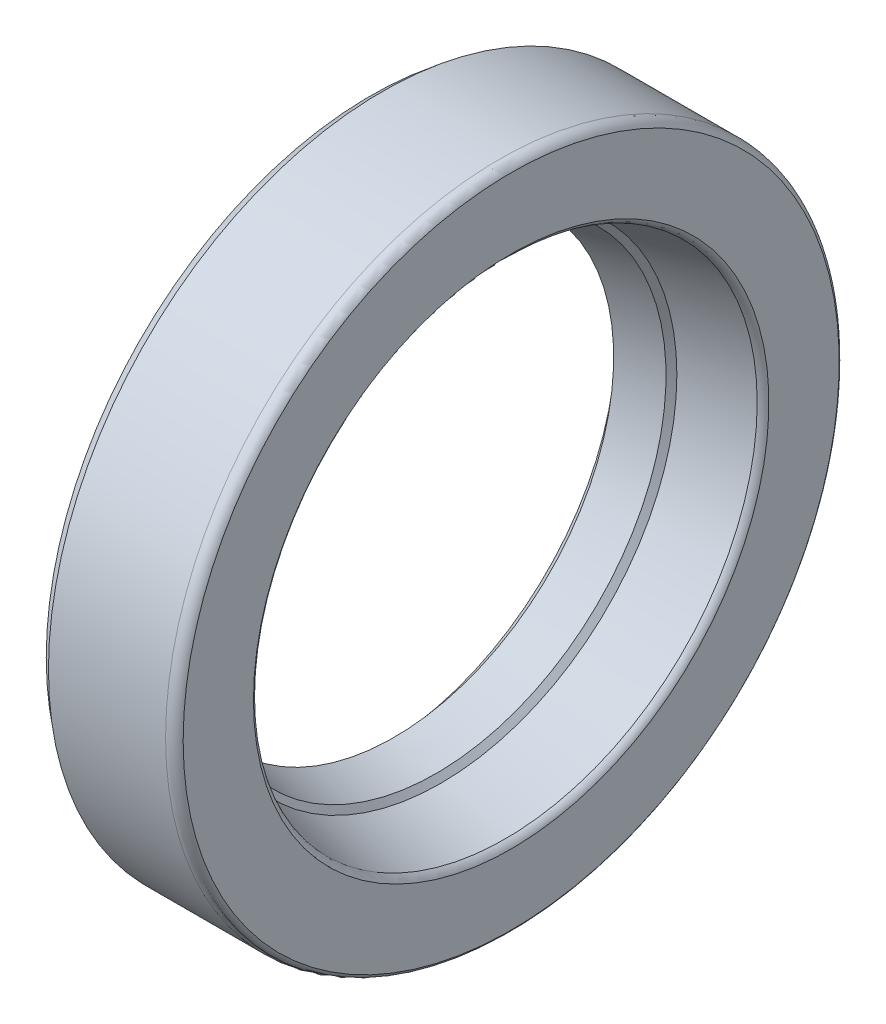
ISO-10303-21;
HEADER;
FILE_DESCRIPTION(('STEP AP214'),'2;1');
FILE_NAME('part.step','',(''),(''),'','','');
FILE_SCHEMA(('AUTOMOTIVE_DESIGN { 1 0 10303 214 1 1 1 1 }'));
ENDSEC;
DATA;
#1=APPLICATION_CONTEXT('core data for automotive mechanical design processes');
#2=APPLICATION_PROTOCOL_DEFINITION('international standard','automotive_design',2000,#1);
#3=PRODUCT_CONTEXT('',#1,'mechanical');
#4=PRODUCT('Part','Part','',(#3));
#5=PRODUCT_RELATED_PRODUCT_CATEGORY('part','',(#4));
#6=PRODUCT_DEFINITION_FORMATION('','',#4);
#7=PRODUCT_DEFINITION_CONTEXT('part definition',#1,'design');
#8=PRODUCT_DEFINITION('design','',#6,#7);
#9=PRODUCT_DEFINITION_SHAPE('','',#8);
#10=(LENGTH_UNIT() NAMED_UNIT(*) SI_UNIT(.MILLI.,.METRE.));
#11=(NAMED_UNIT(*) PLANE_ANGLE_UNIT() SI_UNIT($,.RADIAN.));
#12=(NAMED_UNIT(*) SI_UNIT($,.STERADIAN.) SOLID_ANGLE_UNIT());
#13=UNCERTAINTY_MEASURE_WITH_UNIT(LENGTH_MEASURE(1.E-05),#10,'distance_accuracy_value','');
#14=(GEOMETRIC_REPRESENTATION_CONTEXT(3) GLOBAL_UNCERTAINTY_ASSIGNED_CONTEXT((#13)) GLOBAL_UNIT_ASSIGNED_CONTEXT((#10,
#11,#12)) REPRESENTATION_CONTEXT('',''));
#15=CARTESIAN_POINT('',(0.,0.,0.));
#16=DIRECTION('',(0.,0.,1.));
#17=DIRECTION('',(1.,0.,0.));
#18=AXIS2_PLACEMENT_3D('',#15,#16,#17);
#19=CARTESIAN_POINT('',(0.,0.,0.));
#20=DIRECTION('',(-1.,0.,0.));
#21=DIRECTION('',(0.,0.,1.));
#22=AXIS2_PLACEMENT_3D('',#19,#20,#21);
#23=CYLINDRICAL_SURFACE('',#22,19.);
#24=CARTESIAN_POINT('',(7.33333333333333,0.,0.));
#25=DIRECTION('',(-1.,0.,0.));
#26=DIRECTION('',(0.,0.,1.));
#27=AXIS2_PLACEMENT_3D('',#24,#25,#26);
#28=CIRCLE('',#27,19.);
#29=CARTESIAN_POINT('',(7.33333333333333,0.,19.));
#30=VERTEX_POINT('',#29);
#31=EDGE_CURVE('E10',#30,#30,#28,.T.);
#32=ORIENTED_EDGE('',*,*,#31,.T.);
#33=EDGE_LOOP('',(#32));
#34=FACE_BOUND('',#33,.T.);
#35=CARTESIAN_POINT('',(0.666666666666667,0.,0.));
#36=DIRECTION('',(-1.,0.,0.));
#37=DIRECTION('',(0.,0.,1.));
#38=AXIS2_PLACEMENT_3D('',#35,#36,#37);
#39=CIRCLE('',#38,19.);
#40=CARTESIAN_POINT('',(0.666666666666667,0.,19.));
#41=VERTEX_POINT('',#40);
#42=EDGE_CURVE('E70',#41,#41,#39,.T.);
#43=ORIENTED_EDGE('',*,*,#42,.F.);
#44=EDGE_LOOP('',(#43));
#45=FACE_BOUND('',#44,.T.);
#46=ADVANCED_FACE('F15',(#34,#45),#23,.T.);
#47=CARTESIAN_POINT('',(7.41946005043015,0.,0.));
#48=DIRECTION('',(-1.,0.,0.));
#49=DIRECTION('',(0.,0.,1.));
#50=AXIS2_PLACEMENT_3D('',#47,#48,#49);
#51=TOROIDAL_SURFACE('',#50,18.3389201008603,0.666666666666667);
#52=ORIENTED_EDGE('',*,*,#31,.F.);
#53=EDGE_LOOP('',(#52));
#54=FACE_BOUND('',#53,.T.);
#55=CARTESIAN_POINT('',(8.,0.,0.));
#56=DIRECTION('',(-1.,0.,0.));
#57=DIRECTION('',(0.,0.,1.));
#58=AXIS2_PLACEMENT_3D('',#55,#56,#57);
#59=CIRCLE('',#58,18.6666666666667);
#60=CARTESIAN_POINT('',(8.,0.,18.6666666666667));
#61=VERTEX_POINT('',#60);
#62=EDGE_CURVE('E21',#61,#61,#59,.T.);
#63=ORIENTED_EDGE('',*,*,#62,.T.);
#64=EDGE_LOOP('',(#63));
#65=FACE_BOUND('',#64,.T.);
#66=ADVANCED_FACE('F78',(#54,#65),#51,.T.);
#67=CARTESIAN_POINT('',(8.,18.6666666666667,0.));
#68=DIRECTION('',(1.,0.,0.));
#69=DIRECTION('',(0.,0.,-1.));
#70=AXIS2_PLACEMENT_3D('',#67,#68,#69);
#71=PLANE('',#70);
#72=CARTESIAN_POINT('',(8.,0.,0.));
#73=DIRECTION('',(-1.,0.,0.));
#74=DIRECTION('',(0.,0.,1.));
#75=AXIS2_PLACEMENT_3D('',#72,#73,#74);
#76=CIRCLE('',#75,14.6666666666667);
#77=CARTESIAN_POINT('',(8.,0.,14.6666666666667));
#78=VERTEX_POINT('',#77);
#79=EDGE_CURVE('E25',#78,#78,#76,.T.);
#80=ORIENTED_EDGE('',*,*,#79,.T.);
#81=EDGE_LOOP('',(#80));
#82=FACE_BOUND('',#81,.T.);
#83=ORIENTED_EDGE('',*,*,#62,.F.);
#84=EDGE_LOOP('',(#83));
#85=FACE_BOUND('',#84,.T.);
#86=ADVANCED_FACE('F83',(#82,#85),#71,.T.);
#87=CARTESIAN_POINT('',(7.39237478148924,0.,0.));
#88=DIRECTION('',(-1.,0.,0.));
#89=DIRECTION('',(0.,0.,1.));
#90=AXIS2_PLACEMENT_3D('',#87,#88,#89);
#91=TOROIDAL_SURFACE('',#90,14.9409585518441,0.666666666666667);
#92=ORIENTED_EDGE('',*,*,#79,.F.);
#93=EDGE_LOOP('',(#92));
#94=FACE_BOUND('',#93,.T.);
#95=CARTESIAN_POINT('',(7.66666666666667,0.,0.));
#96=DIRECTION('',(-1.,0.,0.));
#97=DIRECTION('',(0.,0.,1.));
#98=AXIS2_PLACEMENT_3D('',#95,#96,#97);
#99=CIRCLE('',#98,14.3333333333333);
#100=CARTESIAN_POINT('',(7.66666666666667,0.,14.3333333333333));
#101=VERTEX_POINT('',#100);
#102=EDGE_CURVE('E29',#101,#101,#99,.T.);
#103=ORIENTED_EDGE('',*,*,#102,.T.);
#104=EDGE_LOOP('',(#103));
#105=FACE_BOUND('',#104,.T.);
#106=ADVANCED_FACE('F88',(#94,#105),#91,.T.);
#107=CARTESIAN_POINT('',(7.66666666666667,0.,0.));
#108=DIRECTION('',(1.,0.,0.));
#109=DIRECTION('',(0.,0.,-1.));
#110=AXIS2_PLACEMENT_3D('',#107,#108,#109);
#111=CONICAL_SURFACE('',#110,14.3333333333333,0.241920568684405);
#112=CARTESIAN_POINT('',(4.,0.,0.));
#113=DIRECTION('',(-1.,0.,0.));
#114=DIRECTION('',(0.,0.,1.));
#115=AXIS2_PLACEMENT_3D('',#112,#113,#114);
#116=CIRCLE('',#115,13.4285714285714);
#117=CARTESIAN_POINT('',(4.,0.,13.4285714285714));
#118=VERTEX_POINT('',#117);
#119=EDGE_CURVE('E34',#118,#118,#116,.T.);
#120=ORIENTED_EDGE('',*,*,#119,.T.);
#121=EDGE_LOOP('',(#120));
#122=FACE_BOUND('',#121,.T.);
#123=ORIENTED_EDGE('',*,*,#102,.F.);
#124=EDGE_LOOP('',(#123));
#125=FACE_BOUND('',#124,.T.);
#126=ADVANCED_FACE('F94',(#122,#125),#111,.F.);
#127=CARTESIAN_POINT('',(4.,0.,0.));
#128=DIRECTION('',(1.,0.,0.));
#129=DIRECTION('',(0.,0.,-1.));
#130=AXIS2_PLACEMENT_3D('',#127,#128,#129);
#131=CONICAL_SURFACE('',#130,13.4285714285714,0.920811159017041);
#132=CARTESIAN_POINT('',(3.73333333333334,0.,0.));
#133=DIRECTION('',(-1.,0.,0.));
#134=DIRECTION('',(0.,0.,1.));
#135=AXIS2_PLACEMENT_3D('',#132,#133,#134);
#136=CIRCLE('',#135,13.0777777777778);
#137=CARTESIAN_POINT('',(3.73333333333334,0.,13.0777777777778));
#138=VERTEX_POINT('',#137);
#139=EDGE_CURVE('E37',#138,#138,#136,.T.);
#140=ORIENTED_EDGE('',*,*,#139,.T.);
#141=EDGE_LOOP('',(#140));
#142=FACE_BOUND('',#141,.T.);
#143=ORIENTED_EDGE('',*,*,#119,.F.);
#144=EDGE_LOOP('',(#143));
#145=FACE_BOUND('',#144,.T.);
#146=ADVANCED_FACE('F98',(#142,#145),#131,.F.);
#147=CARTESIAN_POINT('',(3.73333333333334,0.,0.));
#148=DIRECTION('',(1.,0.,0.));
#149=DIRECTION('',(0.,0.,-1.));
#150=AXIS2_PLACEMENT_3D('',#147,#148,#149);
#151=CONICAL_SURFACE('',#150,13.0777777777778,0.236245260718437);
#152=CARTESIAN_POINT('',(1.33333333333333,0.,0.));
#153=DIRECTION('',(-1.,0.,0.));
#154=DIRECTION('',(0.,0.,1.));
#155=AXIS2_PLACEMENT_3D('',#152,#153,#154);
#156=CIRCLE('',#155,12.5);
#157=CARTESIAN_POINT('',(1.33333333333333,0.,12.5));
#158=VERTEX_POINT('',#157);
#159=EDGE_CURVE('E40',#158,#158,#156,.T.);
#160=ORIENTED_EDGE('',*,*,#159,.T.);
#161=EDGE_LOOP('',(#160));
#162=FACE_BOUND('',#161,.T.);
#163=ORIENTED_EDGE('',*,*,#139,.F.);
#164=EDGE_LOOP('',(#163));
#165=FACE_BOUND('',#164,.T.);
#166=ADVANCED_FACE('F102',(#162,#165),#151,.F.);
#167=CARTESIAN_POINT('',(1.33333333333333,0.,0.));
#168=DIRECTION('',(-1.,0.,0.));
#169=DIRECTION('',(0.,0.,1.));
#170=AXIS2_PLACEMENT_3D('',#167,#168,#169);
#171=CONICAL_SURFACE('',#170,12.5,0.85964161504903);
#172=CARTESIAN_POINT('',(0.533333333333333,0.,0.));
#173=DIRECTION('',(-1.,0.,0.));
#174=DIRECTION('',(0.,0.,1.));
#175=AXIS2_PLACEMENT_3D('',#172,#173,#174);
#176=CIRCLE('',#175,13.4285714285714);
#177=CARTESIAN_POINT('',(0.533333333333333,0.,13.4285714285714));
#178=VERTEX_POINT('',#177);
#179=EDGE_CURVE('E43',#178,#178,#176,.T.);
#180=ORIENTED_EDGE('',*,*,#179,.T.);
#181=EDGE_LOOP('',(#180));
#182=FACE_BOUND('',#181,.T.);
#183=ORIENTED_EDGE('',*,*,#159,.F.);
#184=EDGE_LOOP('',(#183));
#185=FACE_BOUND('',#184,.T.);
#186=ADVANCED_FACE('F106',(#182,#185),#171,.F.);
#187=CARTESIAN_POINT('',(0.533333333333333,13.4285714285714,0.));
#188=DIRECTION('',(-1.,0.,0.));
#189=DIRECTION('',(0.,0.,1.));
#190=AXIS2_PLACEMENT_3D('',#187,#188,#189);
#191=PLANE('',#190);
#192=CARTESIAN_POINT('',(0.533333333333334,0.,0.));
#193=DIRECTION('',(-1.,0.,0.));
#194=DIRECTION('',(0.,0.,1.));
#195=AXIS2_PLACEMENT_3D('',#192,#193,#194);
#196=CIRCLE('',#195,14.9362490369794);
#197=CARTESIAN_POINT('',(0.533333333333334,0.,14.9362490369794));
#198=VERTEX_POINT('',#197);
#199=EDGE_CURVE('E46',#198,#198,#196,.T.);
#200=ORIENTED_EDGE('',*,*,#199,.T.);
#201=EDGE_LOOP('',(#200));
#202=FACE_BOUND('',#201,.T.);
#203=ORIENTED_EDGE('',*,*,#179,.F.);
#204=EDGE_LOOP('',(#203));
#205=FACE_BOUND('',#204,.T.);
#206=ADVANCED_FACE('F110',(#202,#205),#191,.T.);
#207=CARTESIAN_POINT('',(0.,0.,0.));
#208=DIRECTION('',(-1.,0.,0.));
#209=DIRECTION('',(0.,0.,1.));
#210=AXIS2_PLACEMENT_3D('',#207,#208,#209);
#211=CYLINDRICAL_SURFACE('',#210,14.9362490369794);
#212=CARTESIAN_POINT('',(1.60709415886245,0.,0.));
#213=DIRECTION('',(-1.,0.,0.));
#214=DIRECTION('',(0.,0.,1.));
#215=AXIS2_PLACEMENT_3D('',#212,#213,#214);
#216=CIRCLE('',#215,14.9362490369794);
#217=CARTESIAN_POINT('',(1.60709415886245,0.,14.9362490369794));
#218=VERTEX_POINT('',#217);
#219=EDGE_CURVE('E49',#218,#218,#216,.T.);
#220=ORIENTED_EDGE('',*,*,#219,.T.);
#221=EDGE_LOOP('',(#220));
#222=FACE_BOUND('',#221,.T.);
#223=ORIENTED_EDGE('',*,*,#199,.F.);
#224=EDGE_LOOP('',(#223));
#225=FACE_BOUND('',#224,.T.);
#226=ADVANCED_FACE('F114',(#222,#225),#211,.T.);
#227=CARTESIAN_POINT('',(2.,0.,0.));
#228=DIRECTION('',(-1.,0.,0.));
#229=DIRECTION('',(0.,0.,1.));
#230=AXIS2_PLACEMENT_3D('',#227,#228,#229);
#231=TOROIDAL_SURFACE('',#230,14.125,0.901387818865997);
#232=ORIENTED_EDGE('',*,*,#219,.F.);
#233=EDGE_LOOP('',(#232));
#234=FACE_BOUND('',#233,.T.);
#235=CARTESIAN_POINT('',(2.88498024511177,0.,0.));
#236=DIRECTION('',(-1.,0.,0.));
#237=DIRECTION('',(0.,0.,1.));
#238=AXIS2_PLACEMENT_3D('',#235,#236,#237);
#239=CIRCLE('',#238,14.2962015355127);
#240=CARTESIAN_POINT('',(2.88498024511177,0.,14.2962015355127));
#241=VERTEX_POINT('',#240);
#242=EDGE_CURVE('E52',#241,#241,#239,.T.);
#243=ORIENTED_EDGE('',*,*,#242,.T.);
#244=EDGE_LOOP('',(#243));
#245=FACE_BOUND('',#244,.T.);
#246=ADVANCED_FACE('F118',(#234,#245),#231,.T.);
#247=CARTESIAN_POINT('',(4.8,0.,0.));
#248=DIRECTION('',(1.,0.,0.));
#249=DIRECTION('',(0.,0.,-1.));
#250=AXIS2_PLACEMENT_3D('',#247,#248,#249);
#251=CONICAL_SURFACE('',#250,14.6666666666667,0.191091918416452);
#252=ORIENTED_EDGE('',*,*,#242,.F.);
#253=EDGE_LOOP('',(#252));
#254=FACE_BOUND('',#253,.T.);
#255=CARTESIAN_POINT('',(4.8,0.,0.));
#256=DIRECTION('',(-1.,0.,0.));
#257=DIRECTION('',(0.,0.,1.));
#258=AXIS2_PLACEMENT_3D('',#255,#256,#257);
#259=CIRCLE('',#258,14.6666666666667);
#260=CARTESIAN_POINT('',(4.8,0.,14.6666666666667));
#261=VERTEX_POINT('',#260);
#262=EDGE_CURVE('E55',#261,#261,#259,.T.);
#263=ORIENTED_EDGE('',*,*,#262,.T.);
#264=EDGE_LOOP('',(#263));
#265=FACE_BOUND('',#264,.T.);
#266=ADVANCED_FACE('F122',(#254,#265),#251,.T.);
#267=CARTESIAN_POINT('',(4.8,17.0416666666667,0.));
#268=DIRECTION('',(1.,0.,0.));
#269=DIRECTION('',(0.,0.,-1.));
#270=AXIS2_PLACEMENT_3D('',#267,#268,#269);
#271=PLANE('',#270);
#272=ORIENTED_EDGE('',*,*,#262,.F.);
#273=EDGE_LOOP('',(#272));
#274=FACE_BOUND('',#273,.T.);
#275=CARTESIAN_POINT('',(4.8,0.,0.));
#276=DIRECTION('',(-1.,0.,0.));
#277=DIRECTION('',(0.,0.,1.));
#278=AXIS2_PLACEMENT_3D('',#275,#276,#277);
#279=CIRCLE('',#278,17.0416666666667);
#280=CARTESIAN_POINT('',(4.8,0.,17.0416666666667));
#281=VERTEX_POINT('',#280);
#282=EDGE_CURVE('E58',#281,#281,#279,.T.);
#283=ORIENTED_EDGE('',*,*,#282,.T.);
#284=EDGE_LOOP('',(#283));
#285=FACE_BOUND('',#284,.T.);
#286=ADVANCED_FACE('F126',(#274,#285),#271,.F.);
#287=CARTESIAN_POINT('',(4.19237478148924,0.,0.));
#288=DIRECTION('',(-1.,0.,0.));
#289=DIRECTION('',(0.,0.,1.));
#290=AXIS2_PLACEMENT_3D('',#287,#288,#289);
#291=TOROIDAL_SURFACE('',#290,16.7673747814892,0.666666666666667);
#292=CARTESIAN_POINT('',(4.46666666666667,0.,0.));
#293=DIRECTION('',(-1.,0.,0.));
#294=DIRECTION('',(0.,0.,1.));
#295=AXIS2_PLACEMENT_3D('',#292,#293,#294);
#296=CIRCLE('',#295,17.375);
#297=CARTESIAN_POINT('',(4.46666666666667,0.,17.375));
#298=VERTEX_POINT('',#297);
#299=EDGE_CURVE('E61',#298,#298,#296,.T.);
#300=ORIENTED_EDGE('',*,*,#299,.T.);
#301=EDGE_LOOP('',(#300));
#302=FACE_BOUND('',#301,.T.);
#303=ORIENTED_EDGE('',*,*,#282,.F.);
#304=EDGE_LOOP('',(#303));
#305=FACE_BOUND('',#304,.T.);
#306=ADVANCED_FACE('F130',(#302,#305),#291,.F.);
#307=CARTESIAN_POINT('',(0.,0.,0.));
#308=DIRECTION('',(-1.,0.,0.));
#309=DIRECTION('',(0.,0.,1.));
#310=AXIS2_PLACEMENT_3D('',#307,#308,#309);
#311=CONICAL_SURFACE('',#310,17.7,0.0726331964757914);
#312=ORIENTED_EDGE('',*,*,#299,.F.);
#313=EDGE_LOOP('',(#312));
#314=FACE_BOUND('',#313,.T.);
#315=CARTESIAN_POINT('',(0.,0.,0.));
#316=DIRECTION('',(-1.,0.,0.));
#317=DIRECTION('',(0.,0.,1.));
#318=AXIS2_PLACEMENT_3D('',#315,#316,#317);
#319=CIRCLE('',#318,17.7);
#320=CARTESIAN_POINT('',(0.,0.,17.7));
#321=VERTEX_POINT('',#320);
#322=EDGE_CURVE('E64',#321,#321,#319,.T.);
#323=ORIENTED_EDGE('',*,*,#322,.T.);
#324=EDGE_LOOP('',(#323));
#325=FACE_BOUND('',#324,.T.);
#326=ADVANCED_FACE('F134',(#314,#325),#311,.F.);
#327=CARTESIAN_POINT('',(0.,17.7,0.));
#328=DIRECTION('',(-1.,0.,0.));
#329=DIRECTION('',(0.,0.,1.));
#330=AXIS2_PLACEMENT_3D('',#327,#328,#329);
#331=PLANE('',#330);
#332=CARTESIAN_POINT('',(0.,0.,0.));
#333=DIRECTION('',(-1.,0.,0.));
#334=DIRECTION('',(0.,0.,1.));
#335=AXIS2_PLACEMENT_3D('',#332,#333,#334);
#336=CIRCLE('',#335,18.4583333333333);
#337=CARTESIAN_POINT('',(0.,0.,18.4583333333333));
#338=VERTEX_POINT('',#337);
#339=EDGE_CURVE('E67',#338,#338,#336,.T.);
#340=ORIENTED_EDGE('',*,*,#339,.T.);
#341=EDGE_LOOP('',(#340));
#342=FACE_BOUND('',#341,.T.);
#343=ORIENTED_EDGE('',*,*,#322,.F.);
#344=EDGE_LOOP('',(#343));
#345=FACE_BOUND('',#344,.T.);
#346=ADVANCED_FACE('F138',(#342,#345),#331,.T.);
#347=CARTESIAN_POINT('',(0.,0.,0.));
#348=DIRECTION('',(1.,0.,0.));
#349=DIRECTION('',(0.,0.,-1.));
#350=AXIS2_PLACEMENT_3D('',#347,#348,#349);
#351=CONICAL_SURFACE('',#350,18.4583333333333,0.682316554874749);
#352=ORIENTED_EDGE('',*,*,#42,.T.);
#353=EDGE_LOOP('',(#352));
#354=FACE_BOUND('',#353,.T.);
#355=ORIENTED_EDGE('',*,*,#339,.F.);
#356=EDGE_LOOP('',(#355));
#357=FACE_BOUND('',#356,.T.);
#358=ADVANCED_FACE('F74',(#354,#357),#351,.T.);
#359=CLOSED_SHELL('',(#46,#66,#86,#106,#126,#146,#166,#186,#206,#226,#246,#266,#286,#306,#326,
#346,#358));
#360=MANIFOLD_SOLID_BREP('B1',#359);
#361=ADVANCED_BREP_SHAPE_REPRESENTATION('',(#18,#360),#14);
#362=SHAPE_DEFINITION_REPRESENTATION(#9,#361);
ENDSEC;
END-ISO-10303-21;
